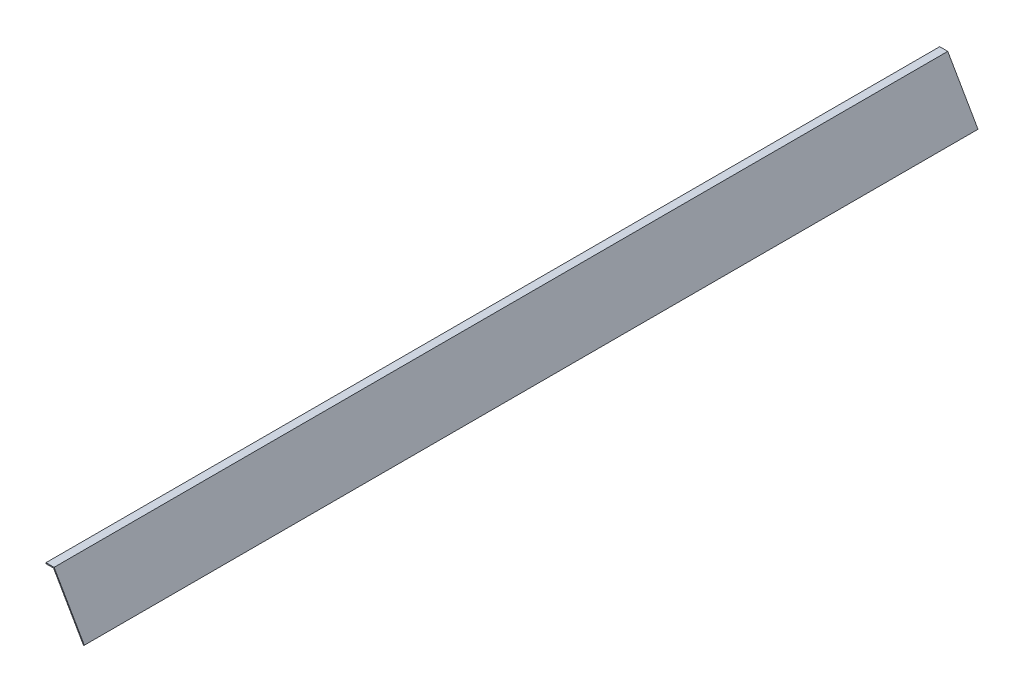
ISO-10303-21;
HEADER;
FILE_DESCRIPTION(('STEP AP214'),'2;1');
FILE_NAME('part.step','',(''),(''),'','','');
FILE_SCHEMA(('AUTOMOTIVE_DESIGN { 1 0 10303 214 1 1 1 1 }'));
ENDSEC;
DATA;
#1=APPLICATION_CONTEXT('core data for automotive mechanical design processes');
#2=APPLICATION_PROTOCOL_DEFINITION('international standard','automotive_design',2000,#1);
#3=PRODUCT_CONTEXT('',#1,'mechanical');
#4=PRODUCT('Part','Part','',(#3));
#5=PRODUCT_RELATED_PRODUCT_CATEGORY('part','',(#4));
#6=PRODUCT_DEFINITION_FORMATION('','',#4);
#7=PRODUCT_DEFINITION_CONTEXT('part definition',#1,'design');
#8=PRODUCT_DEFINITION('design','',#6,#7);
#9=PRODUCT_DEFINITION_SHAPE('','',#8);
#10=(LENGTH_UNIT() NAMED_UNIT(*) SI_UNIT(.MILLI.,.METRE.));
#11=(NAMED_UNIT(*) PLANE_ANGLE_UNIT() SI_UNIT($,.RADIAN.));
#12=(NAMED_UNIT(*) SI_UNIT($,.STERADIAN.) SOLID_ANGLE_UNIT());
#13=UNCERTAINTY_MEASURE_WITH_UNIT(LENGTH_MEASURE(1.E-05),#10,'distance_accuracy_value','');
#14=(GEOMETRIC_REPRESENTATION_CONTEXT(3) GLOBAL_UNCERTAINTY_ASSIGNED_CONTEXT((#13)) GLOBAL_UNIT_ASSIGNED_CONTEXT((#10,
#11,#12)) REPRESENTATION_CONTEXT('',''));
#15=CARTESIAN_POINT('',(0.,0.,0.));
#16=DIRECTION('',(0.,0.,1.));
#17=DIRECTION('',(1.,0.,0.));
#18=AXIS2_PLACEMENT_3D('',#15,#16,#17);
#19=CARTESIAN_POINT('',(-954.25974415715,45.6757254032702,-393.5));
#20=DIRECTION('',(0.,0.,-1.));
#21=DIRECTION('',(-1.,0.,0.));
#22=AXIS2_PLACEMENT_3D('',#19,#20,#21);
#23=PLANE('',#22);
#24=DIRECTION('',(1.,0.,0.));
#25=VECTOR('',#24,1.);
#26=CARTESIAN_POINT('',(-1000.36022510415,127.0241006571,-393.5));
#27=LINE('',#26,#25);
#28=CARTESIAN_POINT('',(-987.8602251043,127.0241006571,-393.5));
#29=VERTEX_POINT('',#28);
#30=CARTESIAN_POINT('',(-1012.860225104,127.0241006571,-393.5));
#31=VERTEX_POINT('',#30);
#32=EDGE_CURVE('E107',#29,#31,#27,.F.);
#33=ORIENTED_EDGE('',*,*,#32,.F.);
#34=DIRECTION('',(-0.500000000000069,0.866025403784399,0.));
#35=VECTOR('',#34,1.);
#36=CARTESIAN_POINT('',(-941.1102251043,46.0507254032702,-393.5));
#37=LINE('',#36,#35);
#38=CARTESIAN_POINT('',(-894.3602251043,-34.9226498505599,-393.5));
#39=VERTEX_POINT('',#38);
#40=EDGE_CURVE('E96',#39,#29,#37,.T.);
#41=ORIENTED_EDGE('',*,*,#40,.F.);
#42=DIRECTION('',(0.866025403788335,0.499999999993252,0.));
#43=VECTOR('',#42,1.);
#44=CARTESIAN_POINT('',(-895.65926321,-35.6726498505598,-393.5));
#45=LINE('',#44,#43);
#46=CARTESIAN_POINT('',(-896.9583013157,-36.4226498505598,-393.5));
#47=VERTEX_POINT('',#46);
#48=EDGE_CURVE('E29',#47,#39,#45,.T.);
#49=ORIENTED_EDGE('',*,*,#48,.F.);
#50=DIRECTION('',(0.500000000000007,-0.866025403784435,0.));
#51=VECTOR('',#50,1.);
#52=CARTESIAN_POINT('',(-943.2752886138,43.8007254032701,-393.5));
#53=LINE('',#52,#51);
#54=CARTESIAN_POINT('',(-989.5922759119,124.0241006571,-393.5));
#55=VERTEX_POINT('',#54);
#56=EDGE_CURVE('E145',#55,#47,#53,.T.);
#57=ORIENTED_EDGE('',*,*,#56,.F.);
#58=DIRECTION('',(1.,0.,0.));
#59=VECTOR('',#58,1.);
#60=CARTESIAN_POINT('',(-1001.22625050795,124.0241006571,-393.5));
#61=LINE('',#60,#59);
#62=CARTESIAN_POINT('',(-1012.860225104,124.0241006571,-393.5));
#63=VERTEX_POINT('',#62);
#64=EDGE_CURVE('E84',#63,#55,#61,.T.);
#65=ORIENTED_EDGE('',*,*,#64,.F.);
#66=DIRECTION('',(0.,1.,0.));
#67=VECTOR('',#66,1.);
#68=CARTESIAN_POINT('',(-1012.860225104,125.5241006571,-393.5));
#69=LINE('',#68,#67);
#70=EDGE_CURVE('E108',#31,#63,#69,.F.);
#71=ORIENTED_EDGE('',*,*,#70,.F.);
#72=EDGE_LOOP('',(#33,#41,#49,#57,#65,#71));
#73=FACE_BOUND('',#72,.T.);
#74=ADVANCED_FACE('F18',(#73),#23,.T.);
#75=CARTESIAN_POINT('',(-943.2752886138,43.8007254032702,484.5));
#76=DIRECTION('',(-0.866025403784435,-0.500000000000007,0.));
#77=DIRECTION('',(0.500000000000007,-0.866025403784435,0.));
#78=AXIS2_PLACEMENT_3D('',#75,#76,#77);
#79=PLANE('',#78);
#80=DIRECTION('',(0.,0.,-1.));
#81=VECTOR('',#80,1.);
#82=CARTESIAN_POINT('',(-989.5922759119,124.0241006571,484.5));
#83=LINE('',#82,#81);
#84=CARTESIAN_POINT('',(-989.5922759119,124.0241006571,2370.));
#85=VERTEX_POINT('',#84);
#86=EDGE_CURVE('E152',#55,#85,#83,.F.);
#87=ORIENTED_EDGE('',*,*,#86,.F.);
#88=ORIENTED_EDGE('',*,*,#56,.T.);
#89=DIRECTION('',(0.,0.,1.));
#90=VECTOR('',#89,1.);
#91=CARTESIAN_POINT('',(-896.9583013157,-36.4226498505598,484.5));
#92=LINE('',#91,#90);
#93=CARTESIAN_POINT('',(-896.9583013157,-36.4226498505596,2370.));
#94=VERTEX_POINT('',#93);
#95=EDGE_CURVE('E75',#94,#47,#92,.F.);
#96=ORIENTED_EDGE('',*,*,#95,.F.);
#97=DIRECTION('',(0.500000000000007,-0.866025403784435,0.));
#98=VECTOR('',#97,1.);
#99=CARTESIAN_POINT('',(-943.2752886138,43.8007254032703,2370.));
#100=LINE('',#99,#98);
#101=EDGE_CURVE('E138',#94,#85,#100,.F.);
#102=ORIENTED_EDGE('',*,*,#101,.T.);
#103=EDGE_LOOP('',(#87,#88,#96,#102));
#104=FACE_BOUND('',#103,.T.);
#105=ADVANCED_FACE('F167',(#104),#79,.T.);
#106=CARTESIAN_POINT('',(-1001.22625050795,124.0241006571,484.5));
#107=DIRECTION('',(0.,-1.,0.));
#108=DIRECTION('',(0.,0.,-1.));
#109=AXIS2_PLACEMENT_3D('',#106,#107,#108);
#110=PLANE('',#109);
#111=ORIENTED_EDGE('',*,*,#86,.T.);
#112=DIRECTION('',(1.,0.,0.));
#113=VECTOR('',#112,1.);
#114=CARTESIAN_POINT('',(-1001.22625050795,124.0241006571,2370.));
#115=LINE('',#114,#113);
#116=CARTESIAN_POINT('',(-1012.860225104,124.0241006571,2370.));
#117=VERTEX_POINT('',#116);
#118=EDGE_CURVE('E135',#85,#117,#115,.F.);
#119=ORIENTED_EDGE('',*,*,#118,.T.);
#120=DIRECTION('',(0.,0.,1.));
#121=VECTOR('',#120,1.);
#122=CARTESIAN_POINT('',(-1012.860225104,124.0241006571,484.5));
#123=LINE('',#122,#121);
#124=EDGE_CURVE('E112',#63,#117,#123,.T.);
#125=ORIENTED_EDGE('',*,*,#124,.F.);
#126=ORIENTED_EDGE('',*,*,#64,.T.);
#127=EDGE_LOOP('',(#111,#119,#125,#126));
#128=FACE_BOUND('',#127,.T.);
#129=ADVANCED_FACE('F166',(#128),#110,.T.);
#130=CARTESIAN_POINT('',(-1012.860225104,125.5241006571,484.5));
#131=DIRECTION('',(-1.,0.,0.));
#132=DIRECTION('',(0.,0.,1.));
#133=AXIS2_PLACEMENT_3D('',#130,#131,#132);
#134=PLANE('',#133);
#135=ORIENTED_EDGE('',*,*,#124,.T.);
#136=DIRECTION('',(0.,1.,0.));
#137=VECTOR('',#136,1.);
#138=CARTESIAN_POINT('',(-1012.860225104,125.5241006571,2370.));
#139=LINE('',#138,#137);
#140=CARTESIAN_POINT('',(-1012.860225104,127.0241006571,2370.));
#141=VERTEX_POINT('',#140);
#142=EDGE_CURVE('E131',#117,#141,#139,.T.);
#143=ORIENTED_EDGE('',*,*,#142,.T.);
#144=DIRECTION('',(0.,0.,1.));
#145=VECTOR('',#144,1.);
#146=CARTESIAN_POINT('',(-1012.860225104,127.0241006571,484.5));
#147=LINE('',#146,#145);
#148=EDGE_CURVE('E104',#31,#141,#147,.T.);
#149=ORIENTED_EDGE('',*,*,#148,.F.);
#150=ORIENTED_EDGE('',*,*,#70,.T.);
#151=EDGE_LOOP('',(#135,#143,#149,#150));
#152=FACE_BOUND('',#151,.T.);
#153=ADVANCED_FACE('F165',(#152),#134,.T.);
#154=CARTESIAN_POINT('',(-1000.36022510415,127.0241006571,484.5));
#155=DIRECTION('',(0.,1.,0.));
#156=DIRECTION('',(0.,0.,1.));
#157=AXIS2_PLACEMENT_3D('',#154,#155,#156);
#158=PLANE('',#157);
#159=ORIENTED_EDGE('',*,*,#148,.T.);
#160=DIRECTION('',(1.,0.,0.));
#161=VECTOR('',#160,1.);
#162=CARTESIAN_POINT('',(-1000.36022510415,127.0241006571,2370.));
#163=LINE('',#162,#161);
#164=CARTESIAN_POINT('',(-987.860225104299,127.0241006571,2370.));
#165=VERTEX_POINT('',#164);
#166=EDGE_CURVE('E117',#141,#165,#163,.T.);
#167=ORIENTED_EDGE('',*,*,#166,.T.);
#168=DIRECTION('',(0.,0.,1.));
#169=VECTOR('',#168,1.);
#170=CARTESIAN_POINT('',(-987.8602251043,127.0241006571,484.5));
#171=LINE('',#170,#169);
#172=EDGE_CURVE('E100',#29,#165,#171,.T.);
#173=ORIENTED_EDGE('',*,*,#172,.F.);
#174=ORIENTED_EDGE('',*,*,#32,.T.);
#175=EDGE_LOOP('',(#159,#167,#173,#174));
#176=FACE_BOUND('',#175,.T.);
#177=ADVANCED_FACE('F115',(#176),#158,.T.);
#178=CARTESIAN_POINT('',(-941.1102251043,46.0507254032702,484.5));
#179=DIRECTION('',(0.866025403784399,0.500000000000069,0.));
#180=DIRECTION('',(-0.500000000000069,0.866025403784399,0.));
#181=AXIS2_PLACEMENT_3D('',#178,#179,#180);
#182=PLANE('',#181);
#183=ORIENTED_EDGE('',*,*,#172,.T.);
#184=DIRECTION('',(-0.500000000000069,0.866025403784399,0.));
#185=VECTOR('',#184,1.);
#186=CARTESIAN_POINT('',(-941.1102251043,46.0507254032703,2370.));
#187=LINE('',#186,#185);
#188=CARTESIAN_POINT('',(-894.3602251043,-34.9226498505596,2370.));
#189=VERTEX_POINT('',#188);
#190=EDGE_CURVE('E127',#165,#189,#187,.F.);
#191=ORIENTED_EDGE('',*,*,#190,.T.);
#192=DIRECTION('',(0.,0.,1.));
#193=VECTOR('',#192,1.);
#194=CARTESIAN_POINT('',(-894.3602251043,-34.9226498505599,484.5));
#195=LINE('',#194,#193);
#196=EDGE_CURVE('E11',#39,#189,#195,.T.);
#197=ORIENTED_EDGE('',*,*,#196,.F.);
#198=ORIENTED_EDGE('',*,*,#40,.T.);
#199=EDGE_LOOP('',(#183,#191,#197,#198));
#200=FACE_BOUND('',#199,.T.);
#201=ADVANCED_FACE('F98',(#200),#182,.T.);
#202=CARTESIAN_POINT('',(-895.65926321,-35.6726498505598,484.5));
#203=DIRECTION('',(0.499999999993252,-0.866025403788335,0.));
#204=DIRECTION('',(0.866025403788335,0.499999999993252,0.));
#205=AXIS2_PLACEMENT_3D('',#202,#203,#204);
#206=PLANE('',#205);
#207=ORIENTED_EDGE('',*,*,#196,.T.);
#208=DIRECTION('',(0.866025403788335,0.499999999993252,0.));
#209=VECTOR('',#208,1.);
#210=CARTESIAN_POINT('',(-895.65926321,-35.6726498505597,2370.));
#211=LINE('',#210,#209);
#212=EDGE_CURVE('E22',#189,#94,#211,.F.);
#213=ORIENTED_EDGE('',*,*,#212,.T.);
#214=ORIENTED_EDGE('',*,*,#95,.T.);
#215=ORIENTED_EDGE('',*,*,#48,.T.);
#216=EDGE_LOOP('',(#207,#213,#214,#215));
#217=FACE_BOUND('',#216,.T.);
#218=ADVANCED_FACE('F177',(#217),#206,.T.);
#219=CARTESIAN_POINT('',(-954.25974415715,45.6757254032703,2370.));
#220=DIRECTION('',(0.,0.,1.));
#221=DIRECTION('',(1.,0.,0.));
#222=AXIS2_PLACEMENT_3D('',#219,#220,#221);
#223=PLANE('',#222);
#224=ORIENTED_EDGE('',*,*,#118,.F.);
#225=ORIENTED_EDGE('',*,*,#101,.F.);
#226=ORIENTED_EDGE('',*,*,#212,.F.);
#227=ORIENTED_EDGE('',*,*,#190,.F.);
#228=ORIENTED_EDGE('',*,*,#166,.F.);
#229=ORIENTED_EDGE('',*,*,#142,.F.);
#230=EDGE_LOOP('',(#224,#225,#226,#227,#228,#229));
#231=FACE_BOUND('',#230,.T.);
#232=ADVANCED_FACE('F20',(#231),#223,.T.);
#233=CLOSED_SHELL('',(#74,#105,#129,#153,#177,#201,#218,#232));
#234=MANIFOLD_SOLID_BREP('B1',#233);
#235=ADVANCED_BREP_SHAPE_REPRESENTATION('',(#18,#234),#14);
#236=SHAPE_DEFINITION_REPRESENTATION(#9,#235);
ENDSEC;
END-ISO-10303-21;
